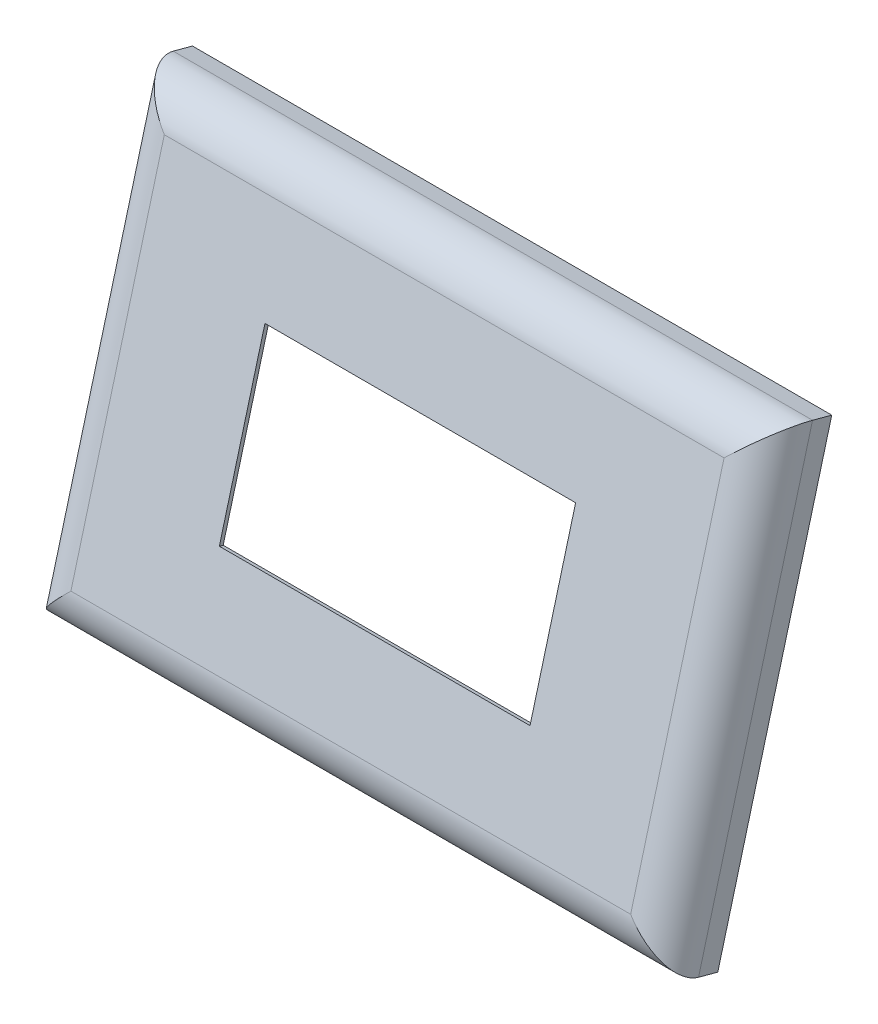
ISO-10303-21;
HEADER;
FILE_DESCRIPTION(('STEP AP214'),'2;1');
FILE_NAME('part.step','',(''),(''),'','','');
FILE_SCHEMA(('AUTOMOTIVE_DESIGN { 1 0 10303 214 1 1 1 1 }'));
ENDSEC;
DATA;
#1=APPLICATION_CONTEXT('core data for automotive mechanical design processes');
#2=APPLICATION_PROTOCOL_DEFINITION('international standard','automotive_design',2000,#1);
#3=PRODUCT_CONTEXT('',#1,'mechanical');
#4=PRODUCT('Part','Part','',(#3));
#5=PRODUCT_RELATED_PRODUCT_CATEGORY('part','',(#4));
#6=PRODUCT_DEFINITION_FORMATION('','',#4);
#7=PRODUCT_DEFINITION_CONTEXT('part definition',#1,'design');
#8=PRODUCT_DEFINITION('design','',#6,#7);
#9=PRODUCT_DEFINITION_SHAPE('','',#8);
#10=(LENGTH_UNIT() NAMED_UNIT(*) SI_UNIT(.MILLI.,.METRE.));
#11=(NAMED_UNIT(*) PLANE_ANGLE_UNIT() SI_UNIT($,.RADIAN.));
#12=(NAMED_UNIT(*) SI_UNIT($,.STERADIAN.) SOLID_ANGLE_UNIT());
#13=UNCERTAINTY_MEASURE_WITH_UNIT(LENGTH_MEASURE(1.E-05),#10,'distance_accuracy_value','');
#14=(GEOMETRIC_REPRESENTATION_CONTEXT(3) GLOBAL_UNCERTAINTY_ASSIGNED_CONTEXT((#13)) GLOBAL_UNIT_ASSIGNED_CONTEXT((#10,
#11,#12)) REPRESENTATION_CONTEXT('',''));
#15=CARTESIAN_POINT('',(0.,0.,0.));
#16=DIRECTION('',(0.,0.,1.));
#17=DIRECTION('',(1.,0.,0.));
#18=AXIS2_PLACEMENT_3D('',#15,#16,#17);
#19=CARTESIAN_POINT('',(1180.92925405442,573.927637011732,-401.417507267825));
#20=DIRECTION('',(-1.,0.,0.));
#21=DIRECTION('',(0.,0.,1.));
#22=AXIS2_PLACEMENT_3D('',#19,#20,#21);
#23=PLANE('',#22);
#24=DIRECTION('',(0.,-0.258819045102521,-0.965925826289068));
#25=VECTOR('',#24,1.);
#26=CARTESIAN_POINT('',(1180.92925405442,573.927637011732,-401.417507267825));
#27=LINE('',#26,#25);
#28=CARTESIAN_POINT('',(1180.92925405442,568.751256109682,-420.736023793607));
#29=VERTEX_POINT('',#28);
#30=CARTESIAN_POINT('',(1180.92925405442,566.163065658656,-430.395282056497));
#31=VERTEX_POINT('',#30);
#32=EDGE_CURVE('E251',#29,#31,#27,.T.);
#33=ORIENTED_EDGE('',*,*,#32,.F.);
#34=DIRECTION('',(0.,0.965925826289068,-0.258819045102521));
#35=VECTOR('',#34,1.);
#36=CARTESIAN_POINT('',(1180.92925405442,354.860567243666,-363.424186443421));
#37=LINE('',#36,#35);
#38=CARTESIAN_POINT('',(1180.92925405442,354.860567243666,-363.424186443421));
#39=VERTEX_POINT('',#38);
#40=EDGE_CURVE('E265',#29,#39,#37,.F.);
#41=ORIENTED_EDGE('',*,*,#40,.T.);
#42=DIRECTION('',(0.,-0.258819045102521,-0.965925826289068));
#43=VECTOR('',#42,1.);
#44=CARTESIAN_POINT('',(1180.92925405442,360.036948145717,-344.10566991764));
#45=LINE('',#44,#43);
#46=CARTESIAN_POINT('',(1180.92925405442,352.272376792641,-373.083444706312));
#47=VERTEX_POINT('',#46);
#48=EDGE_CURVE('E245',#39,#47,#45,.T.);
#49=ORIENTED_EDGE('',*,*,#48,.T.);
#50=DIRECTION('',(0.,0.965925826289068,-0.258819045102521));
#51=VECTOR('',#50,1.);
#52=CARTESIAN_POINT('',(1180.92925405442,566.163065658656,-430.395282056497));
#53=LINE('',#52,#51);
#54=EDGE_CURVE('E232',#47,#31,#53,.T.);
#55=ORIENTED_EDGE('',*,*,#54,.T.);
#56=EDGE_LOOP('',(#33,#41,#49,#55));
#57=FACE_BOUND('',#56,.T.);
#58=ADVANCED_FACE('F33',(#57),#23,.F.);
#59=CARTESIAN_POINT('',(859.49331865993,573.927637011732,-401.417507267825));
#60=DIRECTION('',(0.,-0.965925826289068,0.258819045102521));
#61=DIRECTION('',(0.,-0.258819045102521,-0.965925826289068));
#62=AXIS2_PLACEMENT_3D('',#59,#60,#61);
#63=PLANE('',#62);
#64=DIRECTION('',(0.,-0.258819045102521,-0.965925826289068));
#65=VECTOR('',#64,1.);
#66=CARTESIAN_POINT('',(859.49331865993,573.927637011732,-401.417507267825));
#67=LINE('',#66,#65);
#68=CARTESIAN_POINT('',(859.49331865993,568.751256109682,-420.736023793607));
#69=VERTEX_POINT('',#68);
#70=CARTESIAN_POINT('',(859.49331865993,566.163065658656,-430.395282056497));
#71=VERTEX_POINT('',#70);
#72=EDGE_CURVE('E249',#69,#71,#67,.T.);
#73=ORIENTED_EDGE('',*,*,#72,.F.);
#74=DIRECTION('',(-1.,0.,0.));
#75=VECTOR('',#74,1.);
#76=CARTESIAN_POINT('',(1180.92925405442,568.751256109682,-420.736023793607));
#77=LINE('',#76,#75);
#78=EDGE_CURVE('E269',#69,#29,#77,.F.);
#79=ORIENTED_EDGE('',*,*,#78,.T.);
#80=ORIENTED_EDGE('',*,*,#32,.T.);
#81=DIRECTION('',(-1.,0.,0.));
#82=VECTOR('',#81,1.);
#83=CARTESIAN_POINT('',(859.49331865993,566.163065658656,-430.395282056497));
#84=LINE('',#83,#82);
#85=EDGE_CURVE('E235',#31,#71,#84,.T.);
#86=ORIENTED_EDGE('',*,*,#85,.T.);
#87=EDGE_LOOP('',(#73,#79,#80,#86));
#88=FACE_BOUND('',#87,.T.);
#89=ADVANCED_FACE('F316',(#88),#63,.F.);
#90=CARTESIAN_POINT('',(859.49331865993,573.927637011732,-401.417507267825));
#91=DIRECTION('',(1.,0.,0.));
#92=DIRECTION('',(0.,1.,0.));
#93=AXIS2_PLACEMENT_3D('',#90,#91,#92);
#94=PLANE('',#93);
#95=DIRECTION('',(0.,-0.258819045102521,-0.965925826289068));
#96=VECTOR('',#95,1.);
#97=CARTESIAN_POINT('',(859.49331865993,360.036948145717,-344.10566991764));
#98=LINE('',#97,#96);
#99=CARTESIAN_POINT('',(859.49331865993,354.860567243666,-363.424186443421));
#100=VERTEX_POINT('',#99);
#101=CARTESIAN_POINT('',(859.49331865993,352.272376792641,-373.083444706312));
#102=VERTEX_POINT('',#101);
#103=EDGE_CURVE('E247',#100,#102,#98,.T.);
#104=ORIENTED_EDGE('',*,*,#103,.F.);
#105=DIRECTION('',(0.,-0.965925826289068,0.258819045102521));
#106=VECTOR('',#105,1.);
#107=CARTESIAN_POINT('',(859.49331865993,568.751256109682,-420.736023793607));
#108=LINE('',#107,#106);
#109=EDGE_CURVE('E267',#100,#69,#108,.F.);
#110=ORIENTED_EDGE('',*,*,#109,.T.);
#111=ORIENTED_EDGE('',*,*,#72,.T.);
#112=DIRECTION('',(0.,-0.965925826289068,0.258819045102521));
#113=VECTOR('',#112,1.);
#114=CARTESIAN_POINT('',(859.49331865993,566.163065658656,-430.395282056497));
#115=LINE('',#114,#113);
#116=EDGE_CURVE('E239',#71,#102,#115,.T.);
#117=ORIENTED_EDGE('',*,*,#116,.T.);
#118=EDGE_LOOP('',(#104,#110,#111,#117));
#119=FACE_BOUND('',#118,.T.);
#120=ADVANCED_FACE('F322',(#119),#94,.F.);
#121=CARTESIAN_POINT('',(859.49331865993,360.036948145717,-344.10566991764));
#122=DIRECTION('',(0.,0.965925826289068,-0.258819045102521));
#123=DIRECTION('',(0.,0.258819045102521,0.965925826289068));
#124=AXIS2_PLACEMENT_3D('',#121,#122,#123);
#125=PLANE('',#124);
#126=ORIENTED_EDGE('',*,*,#48,.F.);
#127=DIRECTION('',(1.,0.,0.));
#128=VECTOR('',#127,1.);
#129=CARTESIAN_POINT('',(859.49331865993,354.860567243666,-363.424186443421));
#130=LINE('',#129,#128);
#131=EDGE_CURVE('E262',#39,#100,#130,.F.);
#132=ORIENTED_EDGE('',*,*,#131,.T.);
#133=ORIENTED_EDGE('',*,*,#103,.T.);
#134=DIRECTION('',(1.,0.,0.));
#135=VECTOR('',#134,1.);
#136=CARTESIAN_POINT('',(859.49331865993,352.272376792641,-373.083444706312));
#137=LINE('',#136,#135);
#138=EDGE_CURVE('E242',#102,#47,#137,.T.);
#139=ORIENTED_EDGE('',*,*,#138,.T.);
#140=EDGE_LOOP('',(#126,#132,#133,#139));
#141=FACE_BOUND('',#140,.T.);
#142=ADVANCED_FACE('F451',(#141),#125,.F.);
#143=CARTESIAN_POINT('',(0.,-61.9085151041574,-231.04572378986));
#144=DIRECTION('',(0.,0.258819045102521,0.965925826289068));
#145=DIRECTION('',(0.,-0.965925826289068,0.258819045102521));
#146=AXIS2_PLACEMENT_3D('',#143,#144,#145);
#147=PLANE('',#146);
#148=DIRECTION('',(0.,-0.965925826289068,0.258819045102522));
#149=VECTOR('',#148,1.);
#150=CARTESIAN_POINT('',(942.111286357175,509.77280668333,-384.227272290775));
#151=LINE('',#150,#149);
#152=CARTESIAN_POINT('',(942.111286357175,509.77280668333,-384.227272290775));
#153=VERTEX_POINT('',#152);
#154=CARTESIAN_POINT('',(942.111286357175,424.191778474119,-361.295904894691));
#155=VERTEX_POINT('',#154);
#156=EDGE_CURVE('E48',#153,#155,#151,.T.);
#157=ORIENTED_EDGE('',*,*,#156,.F.);
#158=DIRECTION('',(-1.,0.,0.));
#159=VECTOR('',#158,1.);
#160=CARTESIAN_POINT('',(942.111286357175,509.77280668333,-384.227272290775));
#161=LINE('',#160,#159);
#162=CARTESIAN_POINT('',(1098.31128635718,509.77280668333,-384.227272290775));
#163=VERTEX_POINT('',#162);
#164=EDGE_CURVE('E154',#163,#153,#161,.T.);
#165=ORIENTED_EDGE('',*,*,#164,.F.);
#166=DIRECTION('',(0.,0.965925826289068,-0.258819045102521));
#167=VECTOR('',#166,1.);
#168=CARTESIAN_POINT('',(1098.31128635718,509.77280668333,-384.227272290775));
#169=LINE('',#168,#167);
#170=CARTESIAN_POINT('',(1098.31128635718,424.191778474119,-361.295904894691));
#171=VERTEX_POINT('',#170);
#172=EDGE_CURVE('E174',#171,#163,#169,.T.);
#173=ORIENTED_EDGE('',*,*,#172,.F.);
#174=DIRECTION('',(1.,0.,0.));
#175=VECTOR('',#174,1.);
#176=CARTESIAN_POINT('',(942.111286357175,424.191778474119,-361.295904894691));
#177=LINE('',#176,#175);
#178=EDGE_CURVE('E168',#155,#171,#177,.T.);
#179=ORIENTED_EDGE('',*,*,#178,.F.);
#180=EDGE_LOOP('',(#157,#165,#173,#179));
#181=FACE_BOUND('',#180,.T.);
#182=DIRECTION('',(0.,-0.965925826289068,0.258819045102521));
#183=VECTOR('',#182,1.);
#184=CARTESIAN_POINT('',(879.49331865993,360.036948145717,-344.10566991764));
#185=LINE('',#184,#183);
#186=CARTESIAN_POINT('',(879.49331865993,554.609120485951,-396.241126365775));
#187=VERTEX_POINT('',#186);
#188=CARTESIAN_POINT('',(879.49331865993,379.355464671498,-349.28205081969));
#189=VERTEX_POINT('',#188);
#190=EDGE_CURVE('E255',#187,#189,#185,.T.);
#191=ORIENTED_EDGE('',*,*,#190,.T.);
#192=DIRECTION('',(1.,0.,0.));
#193=VECTOR('',#192,1.);
#194=CARTESIAN_POINT('',(1180.92925405442,379.355464671498,-349.28205081969));
#195=LINE('',#194,#193);
#196=CARTESIAN_POINT('',(1160.92925405442,379.355464671498,-349.28205081969));
#197=VERTEX_POINT('',#196);
#198=EDGE_CURVE('E259',#189,#197,#195,.T.);
#199=ORIENTED_EDGE('',*,*,#198,.T.);
#200=DIRECTION('',(0.,0.965925826289068,-0.258819045102521));
#201=VECTOR('',#200,1.);
#202=CARTESIAN_POINT('',(1160.92925405442,573.927637011732,-401.417507267825));
#203=LINE('',#202,#201);
#204=CARTESIAN_POINT('',(1160.92925405442,554.609120485951,-396.241126365775));
#205=VERTEX_POINT('',#204);
#206=EDGE_CURVE('E257',#197,#205,#203,.T.);
#207=ORIENTED_EDGE('',*,*,#206,.T.);
#208=DIRECTION('',(-1.,0.,0.));
#209=VECTOR('',#208,1.);
#210=CARTESIAN_POINT('',(859.49331865993,554.609120485951,-396.241126365775));
#211=LINE('',#210,#209);
#212=EDGE_CURVE('E253',#205,#187,#211,.T.);
#213=ORIENTED_EDGE('',*,*,#212,.T.);
#214=EDGE_LOOP('',(#191,#199,#207,#213));
#215=FACE_BOUND('',#214,.T.);
#216=ADVANCED_FACE('F448',(#181,#215),#147,.T.);
#217=CARTESIAN_POINT('',(0.,-69.673086457233,-260.023498578532));
#218=DIRECTION('',(0.,0.258819045102521,0.965925826289068));
#219=DIRECTION('',(0.,-0.965925826289068,0.258819045102521));
#220=AXIS2_PLACEMENT_3D('',#217,#218,#219);
#221=PLANE('',#220);
#222=DIRECTION('',(1.,0.,0.));
#223=VECTOR('',#222,1.);
#224=CARTESIAN_POINT('',(859.49331865993,354.204228445219,-373.601082796517));
#225=LINE('',#224,#223);
#226=CARTESIAN_POINT('',(861.49331865993,354.204228445219,-373.601082796517));
#227=VERTEX_POINT('',#226);
#228=CARTESIAN_POINT('',(1178.92925405442,354.204228445219,-373.601082796517));
#229=VERTEX_POINT('',#228);
#230=EDGE_CURVE('E194',#227,#229,#225,.T.);
#231=ORIENTED_EDGE('',*,*,#230,.T.);
#232=DIRECTION('',(0.,0.965925826289068,-0.258819045102521));
#233=VECTOR('',#232,1.);
#234=CARTESIAN_POINT('',(1178.92925405442,566.163065658656,-430.395282056498));
#235=LINE('',#234,#233);
#236=CARTESIAN_POINT('',(1178.92925405442,564.231214006078,-429.877643966292));
#237=VERTEX_POINT('',#236);
#238=EDGE_CURVE('E208',#229,#237,#235,.T.);
#239=ORIENTED_EDGE('',*,*,#238,.T.);
#240=DIRECTION('',(-1.,0.,0.));
#241=VECTOR('',#240,1.);
#242=CARTESIAN_POINT('',(859.49331865993,564.231214006078,-429.877643966292));
#243=LINE('',#242,#241);
#244=CARTESIAN_POINT('',(861.49331865993,564.231214006078,-429.877643966292));
#245=VERTEX_POINT('',#244);
#246=EDGE_CURVE('E224',#237,#245,#243,.T.);
#247=ORIENTED_EDGE('',*,*,#246,.T.);
#248=DIRECTION('',(0.,-0.965925826289068,0.258819045102521));
#249=VECTOR('',#248,1.);
#250=CARTESIAN_POINT('',(861.49331865993,566.163065658656,-430.395282056498));
#251=LINE('',#250,#249);
#252=EDGE_CURVE('E227',#245,#227,#251,.T.);
#253=ORIENTED_EDGE('',*,*,#252,.T.);
#254=EDGE_LOOP('',(#231,#239,#247,#253));
#255=FACE_BOUND('',#254,.T.);
#256=ORIENTED_EDGE('',*,*,#54,.F.);
#257=ORIENTED_EDGE('',*,*,#138,.F.);
#258=ORIENTED_EDGE('',*,*,#116,.F.);
#259=ORIENTED_EDGE('',*,*,#85,.F.);
#260=EDGE_LOOP('',(#256,#257,#258,#259));
#261=FACE_BOUND('',#260,.T.);
#262=ADVANCED_FACE('F344',(#255,#261),#221,.F.);
#263=CARTESIAN_POINT('',(0.,549.4327395839,-415.559642891556));
#264=DIRECTION('',(1.,0.,0.));
#265=DIRECTION('',(0.,0.,-1.));
#266=AXIS2_PLACEMENT_3D('',#263,#264,#265);
#267=CYLINDRICAL_SURFACE('',#266,20.);
#268=CARTESIAN_POINT('',(1160.92925405442,549.4327395839,-415.559642891556));
#269=DIRECTION('',(0.707106781186547,-0.683012701892219,0.18301270189222));
#270=DIRECTION('',(0.707106781186547,0.683012701892219,-0.18301270189222));
#271=AXIS2_PLACEMENT_3D('',#268,#269,#270);
#272=ELLIPSE('',#271,28.2842712474619,20.);
#273=EDGE_CURVE('E275',#29,#205,#272,.T.);
#274=ORIENTED_EDGE('',*,*,#273,.F.);
#275=ORIENTED_EDGE('',*,*,#78,.F.);
#276=CARTESIAN_POINT('',(879.49331865993,549.4327395839,-415.559642891556));
#277=DIRECTION('',(0.707106781186547,0.683012701892219,-0.18301270189222));
#278=DIRECTION('',(0.707106781186548,-0.683012701892219,0.18301270189222));
#279=AXIS2_PLACEMENT_3D('',#276,#277,#278);
#280=ELLIPSE('',#279,28.2842712474619,20.);
#281=EDGE_CURVE('E236',#187,#69,#280,.F.);
#282=ORIENTED_EDGE('',*,*,#281,.F.);
#283=ORIENTED_EDGE('',*,*,#212,.F.);
#284=EDGE_LOOP('',(#274,#275,#282,#283));
#285=FACE_BOUND('',#284,.T.);
#286=ADVANCED_FACE('F340',(#285),#267,.T.);
#287=CARTESIAN_POINT('',(879.493318659931,-67.0848960062073,-250.364240315642));
#288=DIRECTION('',(0.,0.965925826289068,-0.258819045102521));
#289=DIRECTION('',(0.,0.258819045102521,0.965925826289068));
#290=AXIS2_PLACEMENT_3D('',#287,#288,#289);
#291=CYLINDRICAL_SURFACE('',#290,20.);
#292=ORIENTED_EDGE('',*,*,#281,.T.);
#293=ORIENTED_EDGE('',*,*,#109,.F.);
#294=CARTESIAN_POINT('',(879.49331865993,374.179083769448,-368.600567345472));
#295=DIRECTION('',(-0.707106781186548,0.683012701892219,-0.18301270189222));
#296=DIRECTION('',(0.707106781186547,0.683012701892219,-0.18301270189222));
#297=AXIS2_PLACEMENT_3D('',#294,#295,#296);
#298=ELLIPSE('',#297,28.2842712474619,20.);
#299=EDGE_CURVE('E273',#189,#100,#298,.F.);
#300=ORIENTED_EDGE('',*,*,#299,.F.);
#301=ORIENTED_EDGE('',*,*,#190,.F.);
#302=EDGE_LOOP('',(#292,#293,#300,#301));
#303=FACE_BOUND('',#302,.T.);
#304=ADVANCED_FACE('F336',(#303),#291,.T.);
#305=CARTESIAN_POINT('',(1160.92925405442,-67.0848960062078,-250.364240315641));
#306=DIRECTION('',(0.,-0.965925826289068,0.258819045102521));
#307=DIRECTION('',(0.,-0.258819045102521,-0.965925826289068));
#308=AXIS2_PLACEMENT_3D('',#305,#306,#307);
#309=CYLINDRICAL_SURFACE('',#308,20.);
#310=ORIENTED_EDGE('',*,*,#273,.T.);
#311=ORIENTED_EDGE('',*,*,#206,.F.);
#312=CARTESIAN_POINT('',(1160.92925405442,374.179083769448,-368.600567345472));
#313=DIRECTION('',(-0.707106781186547,-0.683012701892219,0.18301270189222));
#314=DIRECTION('',(0.707106781186547,-0.683012701892219,0.18301270189222));
#315=AXIS2_PLACEMENT_3D('',#312,#313,#314);
#316=ELLIPSE('',#315,28.2842712474619,20.);
#317=EDGE_CURVE('E199',#39,#197,#316,.T.);
#318=ORIENTED_EDGE('',*,*,#317,.F.);
#319=ORIENTED_EDGE('',*,*,#40,.F.);
#320=EDGE_LOOP('',(#310,#311,#318,#319));
#321=FACE_BOUND('',#320,.T.);
#322=ADVANCED_FACE('F332',(#321),#309,.T.);
#323=CARTESIAN_POINT('',(0.,374.179083769448,-368.600567345472));
#324=DIRECTION('',(-1.,0.,0.));
#325=DIRECTION('',(0.,0.,1.));
#326=AXIS2_PLACEMENT_3D('',#323,#324,#325);
#327=CYLINDRICAL_SURFACE('',#326,20.);
#328=ORIENTED_EDGE('',*,*,#299,.T.);
#329=ORIENTED_EDGE('',*,*,#131,.F.);
#330=ORIENTED_EDGE('',*,*,#317,.T.);
#331=ORIENTED_EDGE('',*,*,#198,.F.);
#332=EDGE_LOOP('',(#328,#329,#330,#331));
#333=FACE_BOUND('',#332,.T.);
#334=ADVANCED_FACE('F328',(#333),#327,.T.);
#335=CARTESIAN_POINT('',(1178.92925405442,573.927637011732,-401.417507267825));
#336=DIRECTION('',(-1.,0.,0.));
#337=DIRECTION('',(0.,0.,1.));
#338=AXIS2_PLACEMENT_3D('',#335,#336,#337);
#339=PLANE('',#338);
#340=DIRECTION('',(0.,-0.258819045102521,-0.965925826289068));
#341=VECTOR('',#340,1.);
#342=CARTESIAN_POINT('',(1178.92925405442,571.995785359154,-400.89986917762));
#343=LINE('',#342,#341);
#344=CARTESIAN_POINT('',(1178.92925405442,566.819404457104,-420.218385703402));
#345=VERTEX_POINT('',#344);
#346=EDGE_CURVE('E183',#345,#237,#343,.T.);
#347=ORIENTED_EDGE('',*,*,#346,.T.);
#348=ORIENTED_EDGE('',*,*,#238,.F.);
#349=DIRECTION('',(0.,-0.258819045102521,-0.965925826289068));
#350=VECTOR('',#349,1.);
#351=CARTESIAN_POINT('',(1178.92925405442,361.968799798295,-344.623308007845));
#352=LINE('',#351,#350);
#353=CARTESIAN_POINT('',(1178.92925405442,356.792418896244,-363.941824533626));
#354=VERTEX_POINT('',#353);
#355=EDGE_CURVE('E191',#354,#229,#352,.T.);
#356=ORIENTED_EDGE('',*,*,#355,.F.);
#357=DIRECTION('',(0.,-0.965925826289068,0.258819045102521));
#358=VECTOR('',#357,1.);
#359=CARTESIAN_POINT('',(1178.92925405442,-67.0848960062078,-250.364240315641));
#360=LINE('',#359,#358);
#361=EDGE_CURVE('E187',#345,#354,#360,.T.);
#362=ORIENTED_EDGE('',*,*,#361,.F.);
#363=EDGE_LOOP('',(#347,#348,#356,#362));
#364=FACE_BOUND('',#363,.T.);
#365=ADVANCED_FACE('F331',(#364),#339,.T.);
#366=CARTESIAN_POINT('',(859.49331865993,571.995785359154,-400.89986917762));
#367=DIRECTION('',(0.,-0.965925826289068,0.258819045102521));
#368=DIRECTION('',(0.,-0.258819045102521,-0.965925826289068));
#369=AXIS2_PLACEMENT_3D('',#366,#367,#368);
#370=PLANE('',#369);
#371=DIRECTION('',(0.,-0.258819045102521,-0.965925826289068));
#372=VECTOR('',#371,1.);
#373=CARTESIAN_POINT('',(861.49331865993,571.995785359154,-400.89986917762));
#374=LINE('',#373,#372);
#375=CARTESIAN_POINT('',(861.49331865993,566.819404457104,-420.218385703402));
#376=VERTEX_POINT('',#375);
#377=EDGE_CURVE('E186',#376,#245,#374,.T.);
#378=ORIENTED_EDGE('',*,*,#377,.T.);
#379=ORIENTED_EDGE('',*,*,#246,.F.);
#380=ORIENTED_EDGE('',*,*,#346,.F.);
#381=DIRECTION('',(1.,0.,0.));
#382=VECTOR('',#381,1.);
#383=CARTESIAN_POINT('',(859.49331865993,566.819404457103,-420.218385703402));
#384=LINE('',#383,#382);
#385=EDGE_CURVE('E197',#376,#345,#384,.T.);
#386=ORIENTED_EDGE('',*,*,#385,.F.);
#387=EDGE_LOOP('',(#378,#379,#380,#386));
#388=FACE_BOUND('',#387,.T.);
#389=ADVANCED_FACE('F418',(#388),#370,.T.);
#390=CARTESIAN_POINT('',(861.49331865993,573.927637011732,-401.417507267825));
#391=DIRECTION('',(1.,0.,0.));
#392=DIRECTION('',(0.,1.,0.));
#393=AXIS2_PLACEMENT_3D('',#390,#391,#392);
#394=PLANE('',#393);
#395=DIRECTION('',(0.,-0.258819045102521,-0.965925826289068));
#396=VECTOR('',#395,1.);
#397=CARTESIAN_POINT('',(861.49331865993,361.968799798295,-344.623308007845));
#398=LINE('',#397,#396);
#399=CARTESIAN_POINT('',(861.49331865993,356.792418896244,-363.941824533626));
#400=VERTEX_POINT('',#399);
#401=EDGE_CURVE('E193',#400,#227,#398,.T.);
#402=ORIENTED_EDGE('',*,*,#401,.T.);
#403=ORIENTED_EDGE('',*,*,#252,.F.);
#404=ORIENTED_EDGE('',*,*,#377,.F.);
#405=DIRECTION('',(0.,0.965925826289068,-0.258819045102521));
#406=VECTOR('',#405,1.);
#407=CARTESIAN_POINT('',(861.493318659931,-67.0848960062074,-250.364240315642));
#408=LINE('',#407,#406);
#409=EDGE_CURVE('E189',#400,#376,#408,.T.);
#410=ORIENTED_EDGE('',*,*,#409,.F.);
#411=EDGE_LOOP('',(#402,#403,#404,#410));
#412=FACE_BOUND('',#411,.T.);
#413=ADVANCED_FACE('F422',(#412),#394,.T.);
#414=CARTESIAN_POINT('',(859.49331865993,361.968799798295,-344.623308007845));
#415=DIRECTION('',(0.,0.965925826289068,-0.258819045102521));
#416=DIRECTION('',(0.,0.258819045102521,0.965925826289068));
#417=AXIS2_PLACEMENT_3D('',#414,#415,#416);
#418=PLANE('',#417);
#419=ORIENTED_EDGE('',*,*,#355,.T.);
#420=ORIENTED_EDGE('',*,*,#230,.F.);
#421=ORIENTED_EDGE('',*,*,#401,.F.);
#422=DIRECTION('',(1.,0.,0.));
#423=VECTOR('',#422,1.);
#424=CARTESIAN_POINT('',(859.49331865993,356.792418896244,-363.941824533626));
#425=LINE('',#424,#423);
#426=EDGE_CURVE('E190',#354,#400,#425,.F.);
#427=ORIENTED_EDGE('',*,*,#426,.F.);
#428=EDGE_LOOP('',(#419,#420,#421,#427));
#429=FACE_BOUND('',#428,.T.);
#430=ADVANCED_FACE('F426',(#429),#418,.T.);
#431=CARTESIAN_POINT('',(0.,-62.4261531943624,-232.977575442438));
#432=DIRECTION('',(0.,0.258819045102521,0.965925826289068));
#433=DIRECTION('',(0.,-0.965925826289068,0.258819045102521));
#434=AXIS2_PLACEMENT_3D('',#431,#432,#433);
#435=PLANE('',#434);
#436=CARTESIAN_POINT('',(901.394461056649,399.992705647518,-356.882335234042));
#437=DIRECTION('',(0.,0.258819045102521,0.965925826289068));
#438=DIRECTION('',(0.,-0.965925826289068,0.258819045102521));
#439=AXIS2_PLACEMENT_3D('',#436,#437,#438);
#440=CIRCLE('',#439,10.);
#441=CARTESIAN_POINT('',(901.394461056649,390.333447384627,-354.294144783016));
#442=VERTEX_POINT('',#441);
#443=EDGE_CURVE('E291',#442,#442,#440,.T.);
#444=ORIENTED_EDGE('',*,*,#443,.T.);
#445=EDGE_LOOP('',(#444));
#446=FACE_BOUND('',#445,.T.);
#447=CARTESIAN_POINT('',(901.394461056649,532.93660332952,-392.50454525658));
#448=DIRECTION('',(0.,0.258819045102521,0.965925826289068));
#449=DIRECTION('',(0.,-0.965925826289068,0.258819045102521));
#450=AXIS2_PLACEMENT_3D('',#447,#448,#449);
#451=CIRCLE('',#450,10.);
#452=CARTESIAN_POINT('',(901.394461056649,523.277345066629,-389.916354805555));
#453=VERTEX_POINT('',#452);
#454=EDGE_CURVE('E288',#453,#453,#451,.T.);
#455=ORIENTED_EDGE('',*,*,#454,.T.);
#456=EDGE_LOOP('',(#455));
#457=FACE_BOUND('',#456,.T.);
#458=CARTESIAN_POINT('',(1139.0281116577,399.992705647518,-356.882335234042));
#459=DIRECTION('',(0.,0.258819045102521,0.965925826289068));
#460=DIRECTION('',(0.,-0.965925826289068,0.258819045102521));
#461=AXIS2_PLACEMENT_3D('',#458,#459,#460);
#462=CIRCLE('',#461,9.99999999999981);
#463=CARTESIAN_POINT('',(1139.0281116577,390.333447384628,-354.294144783017));
#464=VERTEX_POINT('',#463);
#465=EDGE_CURVE('E285',#464,#464,#462,.T.);
#466=ORIENTED_EDGE('',*,*,#465,.T.);
#467=EDGE_LOOP('',(#466));
#468=FACE_BOUND('',#467,.T.);
#469=CARTESIAN_POINT('',(1139.0281116577,532.93660332952,-392.50454525658));
#470=DIRECTION('',(0.,0.258819045102521,0.965925826289068));
#471=DIRECTION('',(0.,-0.965925826289068,0.258819045102521));
#472=AXIS2_PLACEMENT_3D('',#469,#470,#471);
#473=CIRCLE('',#472,9.99999999999981);
#474=CARTESIAN_POINT('',(1139.0281116577,523.27734506663,-389.916354805555));
#475=VERTEX_POINT('',#474);
#476=EDGE_CURVE('E282',#475,#475,#473,.T.);
#477=ORIENTED_EDGE('',*,*,#476,.T.);
#478=EDGE_LOOP('',(#477));
#479=FACE_BOUND('',#478,.T.);
#480=DIRECTION('',(1.,0.,0.));
#481=VECTOR('',#480,1.);
#482=CARTESIAN_POINT('',(942.111286357175,509.255168593125,-386.159123943353));
#483=LINE('',#482,#481);
#484=CARTESIAN_POINT('',(942.111286357175,509.255168593125,-386.159123943353));
#485=VERTEX_POINT('',#484);
#486=CARTESIAN_POINT('',(1098.31128635718,509.255168593125,-386.159123943353));
#487=VERTEX_POINT('',#486);
#488=EDGE_CURVE('E166',#485,#487,#483,.T.);
#489=ORIENTED_EDGE('',*,*,#488,.F.);
#490=DIRECTION('',(0.,0.965925826289068,-0.258819045102521));
#491=VECTOR('',#490,1.);
#492=CARTESIAN_POINT('',(942.111286357175,509.255168593125,-386.159123943353));
#493=LINE('',#492,#491);
#494=CARTESIAN_POINT('',(942.111286357175,423.674140383914,-363.227756547269));
#495=VERTEX_POINT('',#494);
#496=EDGE_CURVE('E148',#495,#485,#493,.T.);
#497=ORIENTED_EDGE('',*,*,#496,.F.);
#498=DIRECTION('',(-1.,0.,0.));
#499=VECTOR('',#498,1.);
#500=CARTESIAN_POINT('',(942.111286357175,423.674140383914,-363.227756547269));
#501=LINE('',#500,#499);
#502=CARTESIAN_POINT('',(1098.31128635718,423.674140383914,-363.227756547269));
#503=VERTEX_POINT('',#502);
#504=EDGE_CURVE('E157',#503,#495,#501,.T.);
#505=ORIENTED_EDGE('',*,*,#504,.F.);
#506=DIRECTION('',(0.,-0.965925826289068,0.258819045102521));
#507=VECTOR('',#506,1.);
#508=CARTESIAN_POINT('',(1098.31128635718,509.255168593125,-386.159123943353));
#509=LINE('',#508,#507);
#510=EDGE_CURVE('E56',#487,#503,#509,.T.);
#511=ORIENTED_EDGE('',*,*,#510,.F.);
#512=EDGE_LOOP('',(#489,#497,#505,#511));
#513=FACE_BOUND('',#512,.T.);
#514=DIRECTION('',(0.,-0.965925826289068,0.258819045102521));
#515=VECTOR('',#514,1.);
#516=CARTESIAN_POINT('',(879.49331865993,-62.4261531943624,-232.977575442438));
#517=LINE('',#516,#515);
#518=CARTESIAN_POINT('',(879.49331865993,554.091482395746,-398.172978018353));
#519=VERTEX_POINT('',#518);
#520=CARTESIAN_POINT('',(879.49331865993,378.837826581293,-351.213902472269));
#521=VERTEX_POINT('',#520);
#522=EDGE_CURVE('E212',#519,#521,#517,.T.);
#523=ORIENTED_EDGE('',*,*,#522,.F.);
#524=DIRECTION('',(1.,0.,0.));
#525=VECTOR('',#524,1.);
#526=CARTESIAN_POINT('',(0.,554.091482395746,-398.172978018353));
#527=LINE('',#526,#525);
#528=CARTESIAN_POINT('',(1160.92925405442,554.091482395746,-398.172978018353));
#529=VERTEX_POINT('',#528);
#530=EDGE_CURVE('E185',#529,#519,#527,.F.);
#531=ORIENTED_EDGE('',*,*,#530,.F.);
#532=DIRECTION('',(0.,-0.965925826289068,0.258819045102521));
#533=VECTOR('',#532,1.);
#534=CARTESIAN_POINT('',(1160.92925405442,-62.4261531943624,-232.977575442438));
#535=LINE('',#534,#533);
#536=CARTESIAN_POINT('',(1160.92925405442,378.837826581293,-351.213902472269));
#537=VERTEX_POINT('',#536);
#538=EDGE_CURVE('E214',#537,#529,#535,.F.);
#539=ORIENTED_EDGE('',*,*,#538,.F.);
#540=DIRECTION('',(1.,0.,0.));
#541=VECTOR('',#540,1.);
#542=CARTESIAN_POINT('',(0.,378.837826581293,-351.213902472269));
#543=LINE('',#542,#541);
#544=EDGE_CURVE('E204',#521,#537,#543,.T.);
#545=ORIENTED_EDGE('',*,*,#544,.F.);
#546=EDGE_LOOP('',(#523,#531,#539,#545));
#547=FACE_BOUND('',#546,.T.);
#548=ADVANCED_FACE('F163',(#446,#457,#468,#479,#513,#547),#435,.F.);
#549=CARTESIAN_POINT('',(0.,549.4327395839,-415.559642891556));
#550=DIRECTION('',(1.,0.,0.));
#551=DIRECTION('',(0.,0.,-1.));
#552=AXIS2_PLACEMENT_3D('',#549,#550,#551);
#553=CYLINDRICAL_SURFACE('',#552,18.);
#554=CARTESIAN_POINT('',(1160.92925405442,549.4327395839,-415.559642891556));
#555=DIRECTION('',(0.707106781186547,-0.683012701892219,0.18301270189222));
#556=DIRECTION('',(-0.707106781186547,-0.683012701892219,0.18301270189222));
#557=AXIS2_PLACEMENT_3D('',#554,#555,#556);
#558=ELLIPSE('',#557,25.4558441227157,18.);
#559=EDGE_CURVE('E209',#345,#529,#558,.T.);
#560=ORIENTED_EDGE('',*,*,#559,.T.);
#561=ORIENTED_EDGE('',*,*,#530,.T.);
#562=CARTESIAN_POINT('',(879.49331865993,549.4327395839,-415.559642891556));
#563=DIRECTION('',(0.707106781186547,0.683012701892219,-0.18301270189222));
#564=DIRECTION('',(-0.707106781186548,0.683012701892219,-0.18301270189222));
#565=AXIS2_PLACEMENT_3D('',#562,#563,#564);
#566=ELLIPSE('',#565,25.4558441227157,18.);
#567=EDGE_CURVE('E205',#519,#376,#566,.F.);
#568=ORIENTED_EDGE('',*,*,#567,.T.);
#569=ORIENTED_EDGE('',*,*,#385,.T.);
#570=EDGE_LOOP('',(#560,#561,#568,#569));
#571=FACE_BOUND('',#570,.T.);
#572=ADVANCED_FACE('F432',(#571),#553,.F.);
#573=CARTESIAN_POINT('',(879.493318659931,-67.0848960062073,-250.364240315642));
#574=DIRECTION('',(0.,0.965925826289068,-0.258819045102521));
#575=DIRECTION('',(0.,0.258819045102521,0.965925826289068));
#576=AXIS2_PLACEMENT_3D('',#573,#574,#575);
#577=CYLINDRICAL_SURFACE('',#576,18.);
#578=ORIENTED_EDGE('',*,*,#567,.F.);
#579=ORIENTED_EDGE('',*,*,#522,.T.);
#580=CARTESIAN_POINT('',(879.49331865993,374.179083769448,-368.600567345472));
#581=DIRECTION('',(-0.707106781186548,0.683012701892219,-0.18301270189222));
#582=DIRECTION('',(-0.707106781186547,-0.683012701892219,0.18301270189222));
#583=AXIS2_PLACEMENT_3D('',#580,#581,#582);
#584=ELLIPSE('',#583,25.4558441227157,18.);
#585=EDGE_CURVE('E210',#521,#400,#584,.F.);
#586=ORIENTED_EDGE('',*,*,#585,.T.);
#587=ORIENTED_EDGE('',*,*,#409,.T.);
#588=EDGE_LOOP('',(#578,#579,#586,#587));
#589=FACE_BOUND('',#588,.T.);
#590=ADVANCED_FACE('F436',(#589),#577,.F.);
#591=CARTESIAN_POINT('',(1160.92925405442,-67.0848960062078,-250.364240315641));
#592=DIRECTION('',(0.,-0.965925826289068,0.258819045102521));
#593=DIRECTION('',(0.,-0.258819045102521,-0.965925826289068));
#594=AXIS2_PLACEMENT_3D('',#591,#592,#593);
#595=CYLINDRICAL_SURFACE('',#594,18.);
#596=ORIENTED_EDGE('',*,*,#559,.F.);
#597=ORIENTED_EDGE('',*,*,#361,.T.);
#598=CARTESIAN_POINT('',(1160.92925405442,374.179083769448,-368.600567345472));
#599=DIRECTION('',(-0.707106781186547,-0.683012701892219,0.18301270189222));
#600=DIRECTION('',(-0.707106781186547,0.683012701892219,-0.18301270189222));
#601=AXIS2_PLACEMENT_3D('',#598,#599,#600);
#602=ELLIPSE('',#601,25.4558441227157,18.);
#603=EDGE_CURVE('E160',#354,#537,#602,.T.);
#604=ORIENTED_EDGE('',*,*,#603,.T.);
#605=ORIENTED_EDGE('',*,*,#538,.T.);
#606=EDGE_LOOP('',(#596,#597,#604,#605));
#607=FACE_BOUND('',#606,.T.);
#608=ADVANCED_FACE('F440',(#607),#595,.F.);
#609=CARTESIAN_POINT('',(0.,374.179083769448,-368.600567345472));
#610=DIRECTION('',(-1.,0.,0.));
#611=DIRECTION('',(0.,0.,1.));
#612=AXIS2_PLACEMENT_3D('',#609,#610,#611);
#613=CYLINDRICAL_SURFACE('',#612,18.);
#614=ORIENTED_EDGE('',*,*,#585,.F.);
#615=ORIENTED_EDGE('',*,*,#544,.T.);
#616=ORIENTED_EDGE('',*,*,#603,.F.);
#617=ORIENTED_EDGE('',*,*,#426,.T.);
#618=EDGE_LOOP('',(#614,#615,#616,#617));
#619=FACE_BOUND('',#618,.T.);
#620=ADVANCED_FACE('F415',(#619),#613,.F.);
#621=CARTESIAN_POINT('',(942.111286357175,487.67995900541,-466.678902308652));
#622=DIRECTION('',(-1.,0.,0.));
#623=DIRECTION('',(0.,0.,1.));
#624=AXIS2_PLACEMENT_3D('',#621,#622,#623);
#625=PLANE('',#624);
#626=ORIENTED_EDGE('',*,*,#496,.T.);
#627=DIRECTION('',(0.,0.258819045102521,0.965925826289068));
#628=VECTOR('',#627,1.);
#629=CARTESIAN_POINT('',(942.111286357175,487.67995900541,-466.678902308652));
#630=LINE('',#629,#628);
#631=EDGE_CURVE('E161',#485,#153,#630,.T.);
#632=ORIENTED_EDGE('',*,*,#631,.T.);
#633=ORIENTED_EDGE('',*,*,#156,.T.);
#634=DIRECTION('',(0.,0.258819045102521,0.965925826289068));
#635=VECTOR('',#634,1.);
#636=CARTESIAN_POINT('',(942.111286357175,402.098930796199,-443.747534912569));
#637=LINE('',#636,#635);
#638=EDGE_CURVE('E144',#495,#155,#637,.T.);
#639=ORIENTED_EDGE('',*,*,#638,.F.);
#640=EDGE_LOOP('',(#626,#632,#633,#639));
#641=FACE_BOUND('',#640,.T.);
#642=ADVANCED_FACE('F146',(#641),#625,.F.);
#643=CARTESIAN_POINT('',(942.111286357175,487.67995900541,-466.678902308652));
#644=DIRECTION('',(0.,0.965925826289068,-0.258819045102521));
#645=DIRECTION('',(0.,0.258819045102521,0.965925826289068));
#646=AXIS2_PLACEMENT_3D('',#643,#644,#645);
#647=PLANE('',#646);
#648=ORIENTED_EDGE('',*,*,#488,.T.);
#649=DIRECTION('',(0.,0.258819045102521,0.965925826289068));
#650=VECTOR('',#649,1.);
#651=CARTESIAN_POINT('',(1098.31128635718,487.67995900541,-466.678902308652));
#652=LINE('',#651,#650);
#653=EDGE_CURVE('E180',#487,#163,#652,.T.);
#654=ORIENTED_EDGE('',*,*,#653,.T.);
#655=ORIENTED_EDGE('',*,*,#164,.T.);
#656=ORIENTED_EDGE('',*,*,#631,.F.);
#657=EDGE_LOOP('',(#648,#654,#655,#656));
#658=FACE_BOUND('',#657,.T.);
#659=ADVANCED_FACE('F404',(#658),#647,.F.);
#660=CARTESIAN_POINT('',(1098.31128635718,487.67995900541,-466.678902308652));
#661=DIRECTION('',(1.,0.,0.));
#662=DIRECTION('',(0.,0.,-1.));
#663=AXIS2_PLACEMENT_3D('',#660,#661,#662);
#664=PLANE('',#663);
#665=ORIENTED_EDGE('',*,*,#510,.T.);
#666=DIRECTION('',(0.,0.258819045102521,0.965925826289068));
#667=VECTOR('',#666,1.);
#668=CARTESIAN_POINT('',(1098.31128635718,402.098930796199,-443.747534912569));
#669=LINE('',#668,#667);
#670=EDGE_CURVE('E153',#503,#171,#669,.T.);
#671=ORIENTED_EDGE('',*,*,#670,.T.);
#672=ORIENTED_EDGE('',*,*,#172,.T.);
#673=ORIENTED_EDGE('',*,*,#653,.F.);
#674=EDGE_LOOP('',(#665,#671,#672,#673));
#675=FACE_BOUND('',#674,.T.);
#676=ADVANCED_FACE('F407',(#675),#664,.F.);
#677=CARTESIAN_POINT('',(942.111286357175,402.098930796199,-443.747534912569));
#678=DIRECTION('',(0.,-0.965925826289068,0.258819045102521));
#679=DIRECTION('',(0.,-0.258819045102521,-0.965925826289068));
#680=AXIS2_PLACEMENT_3D('',#677,#678,#679);
#681=PLANE('',#680);
#682=ORIENTED_EDGE('',*,*,#504,.T.);
#683=ORIENTED_EDGE('',*,*,#638,.T.);
#684=ORIENTED_EDGE('',*,*,#178,.T.);
#685=ORIENTED_EDGE('',*,*,#670,.F.);
#686=EDGE_LOOP('',(#682,#683,#684,#685));
#687=FACE_BOUND('',#686,.T.);
#688=ADVANCED_FACE('F158',(#687),#681,.F.);
#689=CARTESIAN_POINT('',(901.394461056649,527.76022242747,-411.823061782362));
#690=DIRECTION('',(0.,-0.258819045102521,-0.965925826289068));
#691=DIRECTION('',(0.,0.965925826289068,-0.258819045102521));
#692=AXIS2_PLACEMENT_3D('',#689,#690,#691);
#693=PLANE('',#692);
#694=CARTESIAN_POINT('',(901.394461056649,527.76022242747,-411.823061782362));
#695=DIRECTION('',(0.,-0.258819045102521,-0.965925826289068));
#696=DIRECTION('',(0.,0.965925826289068,-0.258819045102521));
#697=AXIS2_PLACEMENT_3D('',#694,#695,#696);
#698=CIRCLE('',#697,5.00000000000002);
#699=CARTESIAN_POINT('',(901.394461056649,532.589851558915,-413.117157007874));
#700=VERTEX_POINT('',#699);
#701=EDGE_CURVE('E382',#700,#700,#698,.T.);
#702=ORIENTED_EDGE('',*,*,#701,.T.);
#703=EDGE_LOOP('',(#702));
#704=FACE_BOUND('',#703,.T.);
#705=CARTESIAN_POINT('',(901.394461056649,527.76022242747,-411.823061782362));
#706=DIRECTION('',(0.,-0.258819045102521,-0.965925826289068));
#707=DIRECTION('',(0.,0.965925826289068,-0.258819045102521));
#708=AXIS2_PLACEMENT_3D('',#705,#706,#707);
#709=CIRCLE('',#708,1.49999999999997);
#710=CARTESIAN_POINT('',(901.394461056649,529.209111166903,-412.211290350015));
#711=VERTEX_POINT('',#710);
#712=EDGE_CURVE('E374',#711,#711,#709,.T.);
#713=ORIENTED_EDGE('',*,*,#712,.F.);
#714=EDGE_LOOP('',(#713));
#715=FACE_BOUND('',#714,.T.);
#716=ADVANCED_FACE('F387',(#704,#715),#693,.T.);
#717=CARTESIAN_POINT('',(901.394461056649,527.76022242747,-411.823061782362));
#718=DIRECTION('',(0.,0.258819045102521,0.965925826289068));
#719=DIRECTION('',(0.,-0.965925826289068,0.258819045102521));
#720=AXIS2_PLACEMENT_3D('',#717,#718,#719);
#721=CYLINDRICAL_SURFACE('',#720,5.00000000000002);
#722=CARTESIAN_POINT('',(901.394461056649,531.642508104008,-397.334174388025));
#723=DIRECTION('',(0.,0.258819045102521,0.965925826289068));
#724=DIRECTION('',(0.,-0.965925826289068,0.258819045102521));
#725=AXIS2_PLACEMENT_3D('',#722,#723,#724);
#726=CIRCLE('',#725,5.00000000000002);
#727=CARTESIAN_POINT('',(901.394461056649,526.812878972562,-396.040079162513));
#728=VERTEX_POINT('',#727);
#729=EDGE_CURVE('E294',#728,#728,#726,.F.);
#730=ORIENTED_EDGE('',*,*,#729,.T.);
#731=EDGE_LOOP('',(#730));
#732=FACE_BOUND('',#731,.T.);
#733=ORIENTED_EDGE('',*,*,#701,.F.);
#734=EDGE_LOOP('',(#733));
#735=FACE_BOUND('',#734,.T.);
#736=ADVANCED_FACE('F390',(#732,#735),#721,.T.);
#737=CARTESIAN_POINT('',(901.394461056649,527.76022242747,-411.823061782362));
#738=DIRECTION('',(0.,0.258819045102521,0.965925826289068));
#739=DIRECTION('',(0.,-0.965925826289068,0.258819045102521));
#740=AXIS2_PLACEMENT_3D('',#737,#738,#739);
#741=CYLINDRICAL_SURFACE('',#740,1.49999999999997);
#742=ORIENTED_EDGE('',*,*,#712,.T.);
#743=EDGE_LOOP('',(#742));
#744=FACE_BOUND('',#743,.T.);
#745=CARTESIAN_POINT('',(901.394461056649,532.93660332952,-392.50454525658));
#746=DIRECTION('',(0.,-0.258819045102521,-0.965925826289068));
#747=DIRECTION('',(0.,0.965925826289068,-0.258819045102521));
#748=AXIS2_PLACEMENT_3D('',#745,#746,#747);
#749=CIRCLE('',#748,1.49999999999997);
#750=CARTESIAN_POINT('',(901.394461056649,534.385492068954,-392.892773824234));
#751=VERTEX_POINT('',#750);
#752=EDGE_CURVE('E370',#751,#751,#749,.T.);
#753=ORIENTED_EDGE('',*,*,#752,.F.);
#754=EDGE_LOOP('',(#753));
#755=FACE_BOUND('',#754,.T.);
#756=ADVANCED_FACE('F392',(#744,#755),#741,.F.);
#757=ORIENTED_EDGE('',*,*,#752,.T.);
#758=EDGE_LOOP('',(#757));
#759=FACE_BOUND('',#758,.T.);
#760=ADVANCED_FACE('F399',(#759),#435,.F.);
#761=CARTESIAN_POINT('',(901.394461056649,394.816324745468,-376.200851759823));
#762=DIRECTION('',(0.,-0.258819045102521,-0.965925826289068));
#763=DIRECTION('',(0.,0.965925826289068,-0.258819045102521));
#764=AXIS2_PLACEMENT_3D('',#761,#762,#763);
#765=PLANE('',#764);
#766=CARTESIAN_POINT('',(901.394461056649,394.816324745468,-376.200851759823));
#767=DIRECTION('',(0.,-0.258819045102521,-0.965925826289068));
#768=DIRECTION('',(0.,0.965925826289068,-0.258819045102521));
#769=AXIS2_PLACEMENT_3D('',#766,#767,#768);
#770=CIRCLE('',#769,5.00000000000004);
#771=CARTESIAN_POINT('',(901.394461056649,399.645953876913,-377.494946985336));
#772=VERTEX_POINT('',#771);
#773=EDGE_CURVE('E368',#772,#772,#770,.T.);
#774=ORIENTED_EDGE('',*,*,#773,.T.);
#775=EDGE_LOOP('',(#774));
#776=FACE_BOUND('',#775,.T.);
#777=CARTESIAN_POINT('',(901.394461056649,394.816324745468,-376.200851759823));
#778=DIRECTION('',(0.,-0.258819045102521,-0.965925826289068));
#779=DIRECTION('',(0.,0.965925826289068,-0.258819045102521));
#780=AXIS2_PLACEMENT_3D('',#777,#778,#779);
#781=CIRCLE('',#780,1.49999999999997);
#782=CARTESIAN_POINT('',(901.394461056649,396.265213484901,-376.589080327477));
#783=VERTEX_POINT('',#782);
#784=EDGE_CURVE('E371',#783,#783,#781,.T.);
#785=ORIENTED_EDGE('',*,*,#784,.F.);
#786=EDGE_LOOP('',(#785));
#787=FACE_BOUND('',#786,.T.);
#788=ADVANCED_FACE('F364',(#776,#787),#765,.T.);
#789=CARTESIAN_POINT('',(901.394461056649,394.816324745468,-376.200851759823));
#790=DIRECTION('',(0.,0.258819045102521,0.965925826289068));
#791=DIRECTION('',(0.,-0.965925826289068,0.258819045102521));
#792=AXIS2_PLACEMENT_3D('',#789,#790,#791);
#793=CYLINDRICAL_SURFACE('',#792,5.00000000000004);
#794=CARTESIAN_POINT('',(901.394461056649,398.698610422005,-361.711964365487));
#795=DIRECTION('',(0.,0.258819045102521,0.965925826289068));
#796=DIRECTION('',(0.,-0.965925826289068,0.258819045102521));
#797=AXIS2_PLACEMENT_3D('',#794,#795,#796);
#798=CIRCLE('',#797,5.00000000000004);
#799=CARTESIAN_POINT('',(901.394461056649,393.86898129056,-360.417869139974));
#800=VERTEX_POINT('',#799);
#801=EDGE_CURVE('E271',#800,#800,#798,.F.);
#802=ORIENTED_EDGE('',*,*,#801,.T.);
#803=EDGE_LOOP('',(#802));
#804=FACE_BOUND('',#803,.T.);
#805=ORIENTED_EDGE('',*,*,#773,.F.);
#806=EDGE_LOOP('',(#805));
#807=FACE_BOUND('',#806,.T.);
#808=ADVANCED_FACE('F360',(#804,#807),#793,.T.);
#809=CARTESIAN_POINT('',(901.394461056649,394.816324745468,-376.200851759823));
#810=DIRECTION('',(0.,0.258819045102521,0.965925826289068));
#811=DIRECTION('',(0.,-0.965925826289068,0.258819045102521));
#812=AXIS2_PLACEMENT_3D('',#809,#810,#811);
#813=CYLINDRICAL_SURFACE('',#812,1.49999999999997);
#814=ORIENTED_EDGE('',*,*,#784,.T.);
#815=EDGE_LOOP('',(#814));
#816=FACE_BOUND('',#815,.T.);
#817=CARTESIAN_POINT('',(901.394461056649,399.992705647518,-356.882335234042));
#818=DIRECTION('',(0.,-0.258819045102521,-0.965925826289068));
#819=DIRECTION('',(0.,0.965925826289068,-0.258819045102521));
#820=AXIS2_PLACEMENT_3D('',#817,#818,#819);
#821=CIRCLE('',#820,1.49999999999997);
#822=CARTESIAN_POINT('',(901.394461056649,401.441594386952,-357.270563801696));
#823=VERTEX_POINT('',#822);
#824=EDGE_CURVE('E377',#823,#823,#821,.T.);
#825=ORIENTED_EDGE('',*,*,#824,.F.);
#826=EDGE_LOOP('',(#825));
#827=FACE_BOUND('',#826,.T.);
#828=ADVANCED_FACE('F363',(#816,#827),#813,.F.);
#829=ORIENTED_EDGE('',*,*,#824,.T.);
#830=EDGE_LOOP('',(#829));
#831=FACE_BOUND('',#830,.T.);
#832=ADVANCED_FACE('F589',(#831),#435,.F.);
#833=CARTESIAN_POINT('',(1139.0281116577,394.816324745468,-376.200851759823));
#834=DIRECTION('',(0.,-0.258819045102521,-0.965925826289068));
#835=DIRECTION('',(0.,0.965925826289068,-0.258819045102521));
#836=AXIS2_PLACEMENT_3D('',#833,#834,#835);
#837=PLANE('',#836);
#838=CARTESIAN_POINT('',(1139.0281116577,394.816324745468,-376.200851759823));
#839=DIRECTION('',(0.,-0.258819045102521,-0.965925826289068));
#840=DIRECTION('',(0.,0.965925826289068,-0.258819045102521));
#841=AXIS2_PLACEMENT_3D('',#838,#839,#840);
#842=CIRCLE('',#841,4.99999999999981);
#843=CARTESIAN_POINT('',(1139.0281116577,399.645953876913,-377.494946985336));
#844=VERTEX_POINT('',#843);
#845=EDGE_CURVE('E731',#844,#844,#842,.T.);
#846=ORIENTED_EDGE('',*,*,#845,.T.);
#847=EDGE_LOOP('',(#846));
#848=FACE_BOUND('',#847,.T.);
#849=CARTESIAN_POINT('',(1139.0281116577,394.816324745468,-376.200851759823));
#850=DIRECTION('',(0.,-0.258819045102521,-0.965925826289068));
#851=DIRECTION('',(0.,0.965925826289068,-0.258819045102521));
#852=AXIS2_PLACEMENT_3D('',#849,#850,#851);
#853=CIRCLE('',#852,1.50000000000008);
#854=CARTESIAN_POINT('',(1139.0281116577,396.265213484901,-376.589080327477));
#855=VERTEX_POINT('',#854);
#856=EDGE_CURVE('E723',#855,#855,#853,.T.);
#857=ORIENTED_EDGE('',*,*,#856,.F.);
#858=EDGE_LOOP('',(#857));
#859=FACE_BOUND('',#858,.T.);
#860=ADVANCED_FACE('F615',(#848,#859),#837,.T.);
#861=CARTESIAN_POINT('',(1139.0281116577,394.816324745468,-376.200851759823));
#862=DIRECTION('',(0.,0.258819045102521,0.965925826289068));
#863=DIRECTION('',(0.,-0.965925826289068,0.258819045102521));
#864=AXIS2_PLACEMENT_3D('',#861,#862,#863);
#865=CYLINDRICAL_SURFACE('',#864,4.99999999999981);
#866=CARTESIAN_POINT('',(1139.0281116577,398.698610422005,-361.711964365487));
#867=DIRECTION('',(0.,0.258819045102521,0.965925826289068));
#868=DIRECTION('',(0.,-0.965925826289068,0.258819045102521));
#869=AXIS2_PLACEMENT_3D('',#866,#867,#868);
#870=CIRCLE('',#869,4.99999999999981);
#871=CARTESIAN_POINT('',(1139.0281116577,393.86898129056,-360.417869139974));
#872=VERTEX_POINT('',#871);
#873=EDGE_CURVE('E41',#872,#872,#870,.F.);
#874=ORIENTED_EDGE('',*,*,#873,.T.);
#875=EDGE_LOOP('',(#874));
#876=FACE_BOUND('',#875,.T.);
#877=ORIENTED_EDGE('',*,*,#845,.F.);
#878=EDGE_LOOP('',(#877));
#879=FACE_BOUND('',#878,.T.);
#880=ADVANCED_FACE('F299',(#876,#879),#865,.T.);
#881=CARTESIAN_POINT('',(1139.0281116577,394.816324745468,-376.200851759823));
#882=DIRECTION('',(0.,0.258819045102521,0.965925826289068));
#883=DIRECTION('',(0.,-0.965925826289068,0.258819045102521));
#884=AXIS2_PLACEMENT_3D('',#881,#882,#883);
#885=CYLINDRICAL_SURFACE('',#884,1.50000000000008);
#886=ORIENTED_EDGE('',*,*,#856,.T.);
#887=EDGE_LOOP('',(#886));
#888=FACE_BOUND('',#887,.T.);
#889=CARTESIAN_POINT('',(1139.0281116577,399.992705647518,-356.882335234042));
#890=DIRECTION('',(0.,-0.258819045102521,-0.965925826289068));
#891=DIRECTION('',(0.,0.965925826289068,-0.258819045102521));
#892=AXIS2_PLACEMENT_3D('',#889,#890,#891);
#893=CIRCLE('',#892,1.50000000000008);
#894=CARTESIAN_POINT('',(1139.0281116577,401.441594386952,-357.270563801696));
#895=VERTEX_POINT('',#894);
#896=EDGE_CURVE('E719',#895,#895,#893,.T.);
#897=ORIENTED_EDGE('',*,*,#896,.F.);
#898=EDGE_LOOP('',(#897));
#899=FACE_BOUND('',#898,.T.);
#900=ADVANCED_FACE('F631',(#888,#899),#885,.F.);
#901=ORIENTED_EDGE('',*,*,#896,.T.);
#902=EDGE_LOOP('',(#901));
#903=FACE_BOUND('',#902,.T.);
#904=ADVANCED_FACE('F355',(#903),#435,.F.);
#905=CARTESIAN_POINT('',(1139.0281116577,527.76022242747,-411.823061782362));
#906=DIRECTION('',(0.,-0.258819045102521,-0.965925826289068));
#907=DIRECTION('',(0.,0.965925826289068,-0.258819045102521));
#908=AXIS2_PLACEMENT_3D('',#905,#906,#907);
#909=PLANE('',#908);
#910=CARTESIAN_POINT('',(1139.0281116577,527.76022242747,-411.823061782362));
#911=DIRECTION('',(0.,-0.258819045102521,-0.965925826289068));
#912=DIRECTION('',(0.,0.965925826289068,-0.258819045102521));
#913=AXIS2_PLACEMENT_3D('',#910,#911,#912);
#914=CIRCLE('',#913,4.99999999999981);
#915=CARTESIAN_POINT('',(1139.0281116577,532.589851558915,-413.117157007874));
#916=VERTEX_POINT('',#915);
#917=EDGE_CURVE('E718',#916,#916,#914,.T.);
#918=ORIENTED_EDGE('',*,*,#917,.T.);
#919=EDGE_LOOP('',(#918));
#920=FACE_BOUND('',#919,.T.);
#921=CARTESIAN_POINT('',(1139.0281116577,527.76022242747,-411.823061782362));
#922=DIRECTION('',(0.,-0.258819045102521,-0.965925826289068));
#923=DIRECTION('',(0.,0.965925826289068,-0.258819045102521));
#924=AXIS2_PLACEMENT_3D('',#921,#922,#923);
#925=CIRCLE('',#924,1.50000000000008);
#926=CARTESIAN_POINT('',(1139.0281116577,529.209111166903,-412.211290350015));
#927=VERTEX_POINT('',#926);
#928=EDGE_CURVE('E720',#927,#927,#925,.T.);
#929=ORIENTED_EDGE('',*,*,#928,.F.);
#930=EDGE_LOOP('',(#929));
#931=FACE_BOUND('',#930,.T.);
#932=ADVANCED_FACE('F645',(#920,#931),#909,.T.);
#933=CARTESIAN_POINT('',(1139.0281116577,527.76022242747,-411.823061782362));
#934=DIRECTION('',(0.,0.258819045102521,0.965925826289068));
#935=DIRECTION('',(0.,-0.965925826289068,0.258819045102521));
#936=AXIS2_PLACEMENT_3D('',#933,#934,#935);
#937=CYLINDRICAL_SURFACE('',#936,4.99999999999981);
#938=CARTESIAN_POINT('',(1139.0281116577,531.642508104008,-397.334174388025));
#939=DIRECTION('',(0.,0.258819045102521,0.965925826289068));
#940=DIRECTION('',(0.,-0.965925826289068,0.258819045102521));
#941=AXIS2_PLACEMENT_3D('',#938,#939,#940);
#942=CIRCLE('',#941,4.99999999999981);
#943=CARTESIAN_POINT('',(1139.0281116577,526.812878972562,-396.040079162513));
#944=VERTEX_POINT('',#943);
#945=EDGE_CURVE('E11',#944,#944,#942,.F.);
#946=ORIENTED_EDGE('',*,*,#945,.T.);
#947=EDGE_LOOP('',(#946));
#948=FACE_BOUND('',#947,.T.);
#949=ORIENTED_EDGE('',*,*,#917,.F.);
#950=EDGE_LOOP('',(#949));
#951=FACE_BOUND('',#950,.T.);
#952=ADVANCED_FACE('F653',(#948,#951),#937,.T.);
#953=CARTESIAN_POINT('',(1139.0281116577,527.76022242747,-411.823061782362));
#954=DIRECTION('',(0.,0.258819045102521,0.965925826289068));
#955=DIRECTION('',(0.,-0.965925826289068,0.258819045102521));
#956=AXIS2_PLACEMENT_3D('',#953,#954,#955);
#957=CYLINDRICAL_SURFACE('',#956,1.50000000000008);
#958=ORIENTED_EDGE('',*,*,#928,.T.);
#959=EDGE_LOOP('',(#958));
#960=FACE_BOUND('',#959,.T.);
#961=CARTESIAN_POINT('',(1139.0281116577,532.93660332952,-392.50454525658));
#962=DIRECTION('',(0.,-0.258819045102521,-0.965925826289068));
#963=DIRECTION('',(0.,0.965925826289068,-0.258819045102521));
#964=AXIS2_PLACEMENT_3D('',#961,#962,#963);
#965=CIRCLE('',#964,1.50000000000008);
#966=CARTESIAN_POINT('',(1139.0281116577,534.385492068954,-392.892773824234));
#967=VERTEX_POINT('',#966);
#968=EDGE_CURVE('E726',#967,#967,#965,.T.);
#969=ORIENTED_EDGE('',*,*,#968,.F.);
#970=EDGE_LOOP('',(#969));
#971=FACE_BOUND('',#970,.T.);
#972=ADVANCED_FACE('F352',(#960,#971),#957,.F.);
#973=ORIENTED_EDGE('',*,*,#968,.T.);
#974=EDGE_LOOP('',(#973));
#975=FACE_BOUND('',#974,.T.);
#976=ADVANCED_FACE('F347',(#975),#435,.F.);
#977=CARTESIAN_POINT('',(901.394461056649,398.698610422005,-361.711964365487));
#978=DIRECTION('',(0.,0.258819045102521,0.965925826289068));
#979=DIRECTION('',(0.,-0.965925826289068,0.258819045102521));
#980=AXIS2_PLACEMENT_3D('',#977,#978,#979);
#981=TOROIDAL_SURFACE('',#980,10.,5.);
#982=ORIENTED_EDGE('',*,*,#443,.F.);
#983=EDGE_LOOP('',(#982));
#984=FACE_BOUND('',#983,.T.);
#985=ORIENTED_EDGE('',*,*,#801,.F.);
#986=EDGE_LOOP('',(#985));
#987=FACE_BOUND('',#986,.T.);
#988=ADVANCED_FACE('F311',(#984,#987),#981,.F.);
#989=CARTESIAN_POINT('',(901.394461056649,531.642508104008,-397.334174388025));
#990=DIRECTION('',(0.,0.258819045102521,0.965925826289068));
#991=DIRECTION('',(0.,-0.965925826289068,0.258819045102521));
#992=AXIS2_PLACEMENT_3D('',#989,#990,#991);
#993=TOROIDAL_SURFACE('',#992,10.,5.);
#994=ORIENTED_EDGE('',*,*,#454,.F.);
#995=EDGE_LOOP('',(#994));
#996=FACE_BOUND('',#995,.T.);
#997=ORIENTED_EDGE('',*,*,#729,.F.);
#998=EDGE_LOOP('',(#997));
#999=FACE_BOUND('',#998,.T.);
#1000=ADVANCED_FACE('F304',(#996,#999),#993,.F.);
#1001=CARTESIAN_POINT('',(1139.0281116577,398.698610422005,-361.711964365487));
#1002=DIRECTION('',(0.,0.258819045102521,0.965925826289068));
#1003=DIRECTION('',(0.,-0.965925826289068,0.258819045102521));
#1004=AXIS2_PLACEMENT_3D('',#1001,#1002,#1003);
#1005=TOROIDAL_SURFACE('',#1004,9.99999999999981,5.);
#1006=ORIENTED_EDGE('',*,*,#465,.F.);
#1007=EDGE_LOOP('',(#1006));
#1008=FACE_BOUND('',#1007,.T.);
#1009=ORIENTED_EDGE('',*,*,#873,.F.);
#1010=EDGE_LOOP('',(#1009));
#1011=FACE_BOUND('',#1010,.T.);
#1012=ADVANCED_FACE('F302',(#1008,#1011),#1005,.F.);
#1013=CARTESIAN_POINT('',(1139.0281116577,531.642508104008,-397.334174388025));
#1014=DIRECTION('',(0.,0.258819045102521,0.965925826289068));
#1015=DIRECTION('',(0.,-0.965925826289068,0.258819045102521));
#1016=AXIS2_PLACEMENT_3D('',#1013,#1014,#1015);
#1017=TOROIDAL_SURFACE('',#1016,9.99999999999981,5.);
#1018=ORIENTED_EDGE('',*,*,#476,.F.);
#1019=EDGE_LOOP('',(#1018));
#1020=FACE_BOUND('',#1019,.T.);
#1021=ORIENTED_EDGE('',*,*,#945,.F.);
#1022=EDGE_LOOP('',(#1021));
#1023=FACE_BOUND('',#1022,.T.);
#1024=ADVANCED_FACE('F35',(#1020,#1023),#1017,.F.);
#1025=CLOSED_SHELL('',(#58,#89,#120,#142,#216,#262,#286,#304,#322,#334,#365,#389,#413,#430,#548,
#572,#590,#608,#620,#642,#659,#676,#688,#716,#736,#756,#760,#788,#808,#828,#832,#860,#880,#900,
#904,#932,#952,#972,#976,#988,#1000,#1012,#1024));
#1026=MANIFOLD_SOLID_BREP('B2',#1025);
#1027=ADVANCED_BREP_SHAPE_REPRESENTATION('',(#18,#1026),#14);
#1028=SHAPE_DEFINITION_REPRESENTATION(#9,#1027);
ENDSEC;
END-ISO-10303-21;
